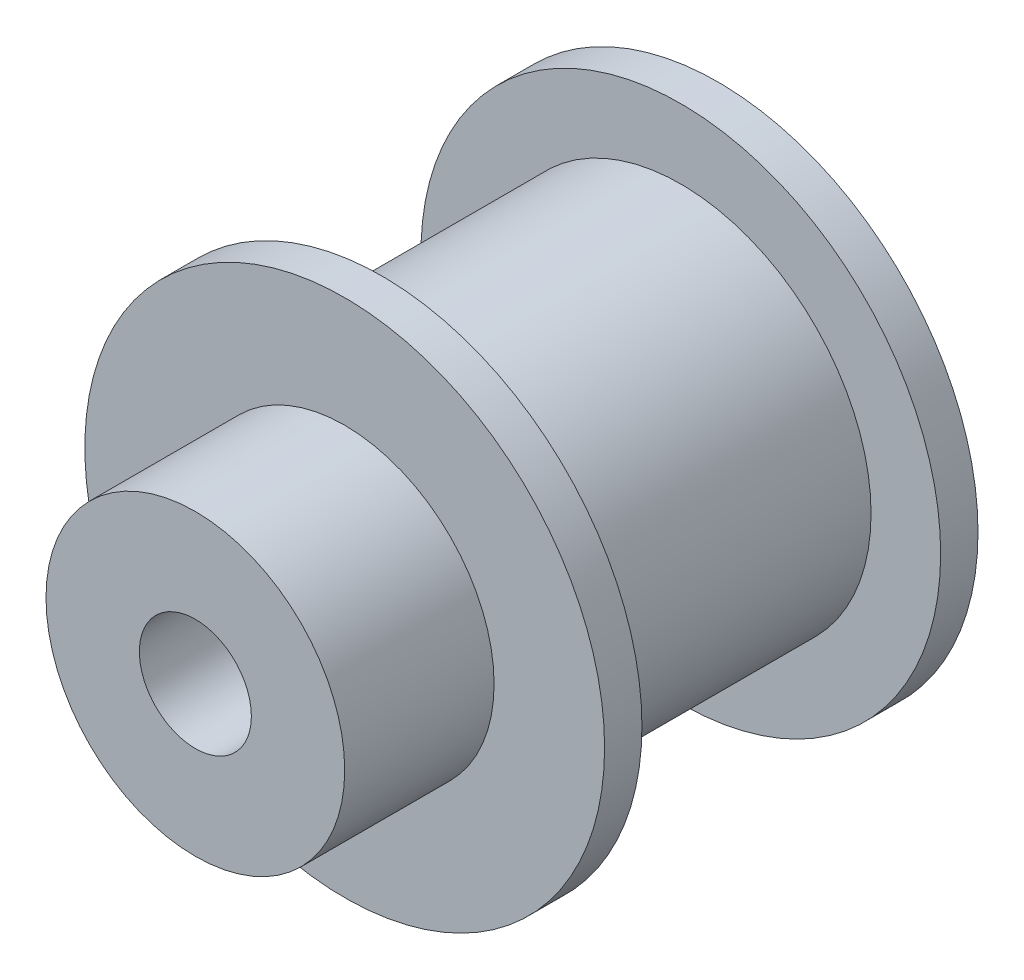
ISO-10303-21;
HEADER;
FILE_DESCRIPTION(('STEP AP214'),'2;1');
FILE_NAME('part.step','',(''),(''),'','','');
FILE_SCHEMA(('AUTOMOTIVE_DESIGN { 1 0 10303 214 1 1 1 1 }'));
ENDSEC;
DATA;
#1=APPLICATION_CONTEXT('core data for automotive mechanical design processes');
#2=APPLICATION_PROTOCOL_DEFINITION('international standard','automotive_design',2000,#1);
#3=PRODUCT_CONTEXT('',#1,'mechanical');
#4=PRODUCT('Part','Part','',(#3));
#5=PRODUCT_RELATED_PRODUCT_CATEGORY('part','',(#4));
#6=PRODUCT_DEFINITION_FORMATION('','',#4);
#7=PRODUCT_DEFINITION_CONTEXT('part definition',#1,'design');
#8=PRODUCT_DEFINITION('design','',#6,#7);
#9=PRODUCT_DEFINITION_SHAPE('','',#8);
#10=(LENGTH_UNIT() NAMED_UNIT(*) SI_UNIT(.MILLI.,.METRE.));
#11=(NAMED_UNIT(*) PLANE_ANGLE_UNIT() SI_UNIT($,.RADIAN.));
#12=(NAMED_UNIT(*) SI_UNIT($,.STERADIAN.) SOLID_ANGLE_UNIT());
#13=UNCERTAINTY_MEASURE_WITH_UNIT(LENGTH_MEASURE(1.E-05),#10,'distance_accuracy_value','');
#14=(GEOMETRIC_REPRESENTATION_CONTEXT(3) GLOBAL_UNCERTAINTY_ASSIGNED_CONTEXT((#13)) GLOBAL_UNIT_ASSIGNED_CONTEXT((#10,
#11,#12)) REPRESENTATION_CONTEXT('',''));
#15=CARTESIAN_POINT('',(0.,0.,0.));
#16=DIRECTION('',(0.,0.,1.));
#17=DIRECTION('',(1.,0.,0.));
#18=AXIS2_PLACEMENT_3D('',#15,#16,#17);
#19=CARTESIAN_POINT('',(0.,0.,15.875));
#20=DIRECTION('',(0.,0.,1.));
#21=DIRECTION('',(1.,0.,0.));
#22=AXIS2_PLACEMENT_3D('',#19,#20,#21);
#23=PLANE('',#22);
#24=CARTESIAN_POINT('',(0.,0.,15.875));
#25=DIRECTION('',(0.,0.,1.));
#26=DIRECTION('',(1.,0.,0.));
#27=AXIS2_PLACEMENT_3D('',#24,#25,#26);
#28=CIRCLE('',#27,11.049);
#29=CARTESIAN_POINT('',(11.049,0.,15.875));
#30=VERTEX_POINT('',#29);
#31=EDGE_CURVE('E47',#30,#30,#28,.T.);
#32=ORIENTED_EDGE('',*,*,#31,.T.);
#33=EDGE_LOOP('',(#32));
#34=FACE_BOUND('',#33,.T.);
#35=CARTESIAN_POINT('',(0.,0.,15.875));
#36=DIRECTION('',(0.,0.,1.));
#37=DIRECTION('',(1.,0.,0.));
#38=AXIS2_PLACEMENT_3D('',#35,#36,#37);
#39=CIRCLE('',#38,6.35);
#40=CARTESIAN_POINT('',(6.35,0.,15.875));
#41=VERTEX_POINT('',#40);
#42=EDGE_CURVE('E56',#41,#41,#39,.T.);
#43=ORIENTED_EDGE('',*,*,#42,.F.);
#44=EDGE_LOOP('',(#43));
#45=FACE_BOUND('',#44,.T.);
#46=ADVANCED_FACE('F31',(#34,#45),#23,.T.);
#47=CARTESIAN_POINT('',(0.,0.,1.5875));
#48=DIRECTION('',(0.,0.,1.));
#49=DIRECTION('',(1.,0.,0.));
#50=AXIS2_PLACEMENT_3D('',#47,#48,#49);
#51=PLANE('',#50);
#52=CARTESIAN_POINT('',(0.,0.,1.5875));
#53=DIRECTION('',(0.,0.,1.));
#54=DIRECTION('',(1.,0.,0.));
#55=AXIS2_PLACEMENT_3D('',#52,#53,#54);
#56=CIRCLE('',#55,11.049);
#57=CARTESIAN_POINT('',(11.049,0.,1.5875));
#58=VERTEX_POINT('',#57);
#59=EDGE_CURVE('E10',#58,#58,#56,.T.);
#60=ORIENTED_EDGE('',*,*,#59,.T.);
#61=EDGE_LOOP('',(#60));
#62=FACE_BOUND('',#61,.T.);
#63=CARTESIAN_POINT('',(0.,0.,1.5875));
#64=DIRECTION('',(0.,0.,1.));
#65=DIRECTION('',(1.,0.,0.));
#66=AXIS2_PLACEMENT_3D('',#63,#64,#65);
#67=CIRCLE('',#66,8.0899);
#68=CARTESIAN_POINT('',(8.0899,0.,1.5875));
#69=VERTEX_POINT('',#68);
#70=EDGE_CURVE('E44',#69,#69,#67,.T.);
#71=ORIENTED_EDGE('',*,*,#70,.F.);
#72=EDGE_LOOP('',(#71));
#73=FACE_BOUND('',#72,.T.);
#74=ADVANCED_FACE('F85',(#62,#73),#51,.T.);
#75=CARTESIAN_POINT('',(0.,0.,1.5875));
#76=DIRECTION('',(0.,0.,-1.));
#77=DIRECTION('',(-1.,0.,0.));
#78=AXIS2_PLACEMENT_3D('',#75,#76,#77);
#79=CYLINDRICAL_SURFACE('',#78,11.049);
#80=ORIENTED_EDGE('',*,*,#59,.F.);
#81=EDGE_LOOP('',(#80));
#82=FACE_BOUND('',#81,.T.);
#83=CARTESIAN_POINT('',(0.,0.,0.));
#84=DIRECTION('',(0.,0.,1.));
#85=DIRECTION('',(1.,0.,0.));
#86=AXIS2_PLACEMENT_3D('',#83,#84,#85);
#87=CIRCLE('',#86,11.049);
#88=CARTESIAN_POINT('',(11.049,0.,0.));
#89=VERTEX_POINT('',#88);
#90=EDGE_CURVE('E35',#89,#89,#87,.T.);
#91=ORIENTED_EDGE('',*,*,#90,.T.);
#92=EDGE_LOOP('',(#91));
#93=FACE_BOUND('',#92,.T.);
#94=ADVANCED_FACE('F33',(#82,#93),#79,.T.);
#95=CARTESIAN_POINT('',(0.,0.,0.));
#96=DIRECTION('',(0.,0.,1.));
#97=DIRECTION('',(1.,0.,0.));
#98=AXIS2_PLACEMENT_3D('',#95,#96,#97);
#99=PLANE('',#98);
#100=CARTESIAN_POINT('',(0.,0.,0.));
#101=DIRECTION('',(0.,0.,1.));
#102=DIRECTION('',(1.,0.,0.));
#103=AXIS2_PLACEMENT_3D('',#100,#101,#102);
#104=CIRCLE('',#103,2.38125);
#105=CARTESIAN_POINT('',(2.38125,0.,0.));
#106=VERTEX_POINT('',#105);
#107=EDGE_CURVE('E59',#106,#106,#104,.T.);
#108=ORIENTED_EDGE('',*,*,#107,.T.);
#109=EDGE_LOOP('',(#108));
#110=FACE_BOUND('',#109,.T.);
#111=ORIENTED_EDGE('',*,*,#90,.F.);
#112=EDGE_LOOP('',(#111));
#113=FACE_BOUND('',#112,.T.);
#114=ADVANCED_FACE('F102',(#110,#113),#99,.F.);
#115=CARTESIAN_POINT('',(0.,0.,14.2875));
#116=DIRECTION('',(0.,0.,-1.));
#117=DIRECTION('',(-1.,0.,0.));
#118=AXIS2_PLACEMENT_3D('',#115,#116,#117);
#119=CYLINDRICAL_SURFACE('',#118,8.0899);
#120=CARTESIAN_POINT('',(0.,0.,14.2875));
#121=DIRECTION('',(0.,0.,1.));
#122=DIRECTION('',(1.,0.,0.));
#123=AXIS2_PLACEMENT_3D('',#120,#121,#122);
#124=CIRCLE('',#123,8.0899);
#125=CARTESIAN_POINT('',(8.0899,0.,14.2875));
#126=VERTEX_POINT('',#125);
#127=EDGE_CURVE('E42',#126,#126,#124,.T.);
#128=ORIENTED_EDGE('',*,*,#127,.F.);
#129=EDGE_LOOP('',(#128));
#130=FACE_BOUND('',#129,.T.);
#131=ORIENTED_EDGE('',*,*,#70,.T.);
#132=EDGE_LOOP('',(#131));
#133=FACE_BOUND('',#132,.T.);
#134=ADVANCED_FACE('F96',(#130,#133),#119,.T.);
#135=CARTESIAN_POINT('',(0.,0.,14.2875));
#136=DIRECTION('',(0.,0.,1.));
#137=DIRECTION('',(1.,0.,0.));
#138=AXIS2_PLACEMENT_3D('',#135,#136,#137);
#139=PLANE('',#138);
#140=CARTESIAN_POINT('',(0.,0.,14.2875));
#141=DIRECTION('',(0.,0.,1.));
#142=DIRECTION('',(1.,0.,0.));
#143=AXIS2_PLACEMENT_3D('',#140,#141,#142);
#144=CIRCLE('',#143,11.049);
#145=CARTESIAN_POINT('',(11.049,0.,14.2875));
#146=VERTEX_POINT('',#145);
#147=EDGE_CURVE('E50',#146,#146,#144,.T.);
#148=ORIENTED_EDGE('',*,*,#147,.F.);
#149=EDGE_LOOP('',(#148));
#150=FACE_BOUND('',#149,.T.);
#151=ORIENTED_EDGE('',*,*,#127,.T.);
#152=EDGE_LOOP('',(#151));
#153=FACE_BOUND('',#152,.T.);
#154=ADVANCED_FACE('F93',(#150,#153),#139,.F.);
#155=CARTESIAN_POINT('',(0.,0.,15.875));
#156=DIRECTION('',(0.,0.,-1.));
#157=DIRECTION('',(-1.,0.,0.));
#158=AXIS2_PLACEMENT_3D('',#155,#156,#157);
#159=CYLINDRICAL_SURFACE('',#158,11.049);
#160=ORIENTED_EDGE('',*,*,#31,.F.);
#161=EDGE_LOOP('',(#160));
#162=FACE_BOUND('',#161,.T.);
#163=ORIENTED_EDGE('',*,*,#147,.T.);
#164=EDGE_LOOP('',(#163));
#165=FACE_BOUND('',#164,.T.);
#166=ADVANCED_FACE('F80',(#162,#165),#159,.T.);
#167=CARTESIAN_POINT('',(0.,0.,22.225));
#168=DIRECTION('',(0.,0.,-1.));
#169=DIRECTION('',(-1.,0.,0.));
#170=AXIS2_PLACEMENT_3D('',#167,#168,#169);
#171=CYLINDRICAL_SURFACE('',#170,6.35);
#172=CARTESIAN_POINT('',(0.,0.,22.225));
#173=DIRECTION('',(0.,0.,1.));
#174=DIRECTION('',(1.,0.,0.));
#175=AXIS2_PLACEMENT_3D('',#172,#173,#174);
#176=CIRCLE('',#175,6.35);
#177=CARTESIAN_POINT('',(6.35,0.,22.225));
#178=VERTEX_POINT('',#177);
#179=EDGE_CURVE('E53',#178,#178,#176,.T.);
#180=ORIENTED_EDGE('',*,*,#179,.F.);
#181=EDGE_LOOP('',(#180));
#182=FACE_BOUND('',#181,.T.);
#183=ORIENTED_EDGE('',*,*,#42,.T.);
#184=EDGE_LOOP('',(#183));
#185=FACE_BOUND('',#184,.T.);
#186=ADVANCED_FACE('F74',(#182,#185),#171,.T.);
#187=CARTESIAN_POINT('',(0.,0.,22.225));
#188=DIRECTION('',(0.,0.,1.));
#189=DIRECTION('',(1.,0.,0.));
#190=AXIS2_PLACEMENT_3D('',#187,#188,#189);
#191=PLANE('',#190);
#192=CARTESIAN_POINT('',(0.,0.,22.225));
#193=DIRECTION('',(0.,0.,1.));
#194=DIRECTION('',(1.,0.,0.));
#195=AXIS2_PLACEMENT_3D('',#192,#193,#194);
#196=CIRCLE('',#195,2.38125);
#197=CARTESIAN_POINT('',(2.38125,0.,22.225));
#198=VERTEX_POINT('',#197);
#199=EDGE_CURVE('E64',#198,#198,#196,.T.);
#200=ORIENTED_EDGE('',*,*,#199,.F.);
#201=EDGE_LOOP('',(#200));
#202=FACE_BOUND('',#201,.T.);
#203=ORIENTED_EDGE('',*,*,#179,.T.);
#204=EDGE_LOOP('',(#203));
#205=FACE_BOUND('',#204,.T.);
#206=ADVANCED_FACE('F71',(#202,#205),#191,.T.);
#207=CARTESIAN_POINT('',(0.,0.,-3.175));
#208=DIRECTION('',(0.,0.,1.));
#209=DIRECTION('',(1.,0.,0.));
#210=AXIS2_PLACEMENT_3D('',#207,#208,#209);
#211=CYLINDRICAL_SURFACE('',#210,2.38125);
#212=ORIENTED_EDGE('',*,*,#199,.T.);
#213=EDGE_LOOP('',(#212));
#214=FACE_BOUND('',#213,.T.);
#215=ORIENTED_EDGE('',*,*,#107,.F.);
#216=EDGE_LOOP('',(#215));
#217=FACE_BOUND('',#216,.T.);
#218=ADVANCED_FACE('F68',(#214,#217),#211,.F.);
#219=CLOSED_SHELL('',(#46,#74,#94,#114,#134,#154,#166,#186,#206,#218));
#220=MANIFOLD_SOLID_BREP('B2',#219);
#221=ADVANCED_BREP_SHAPE_REPRESENTATION('',(#18,#220),#14);
#222=SHAPE_DEFINITION_REPRESENTATION(#9,#221);
ENDSEC;
END-ISO-10303-21;
